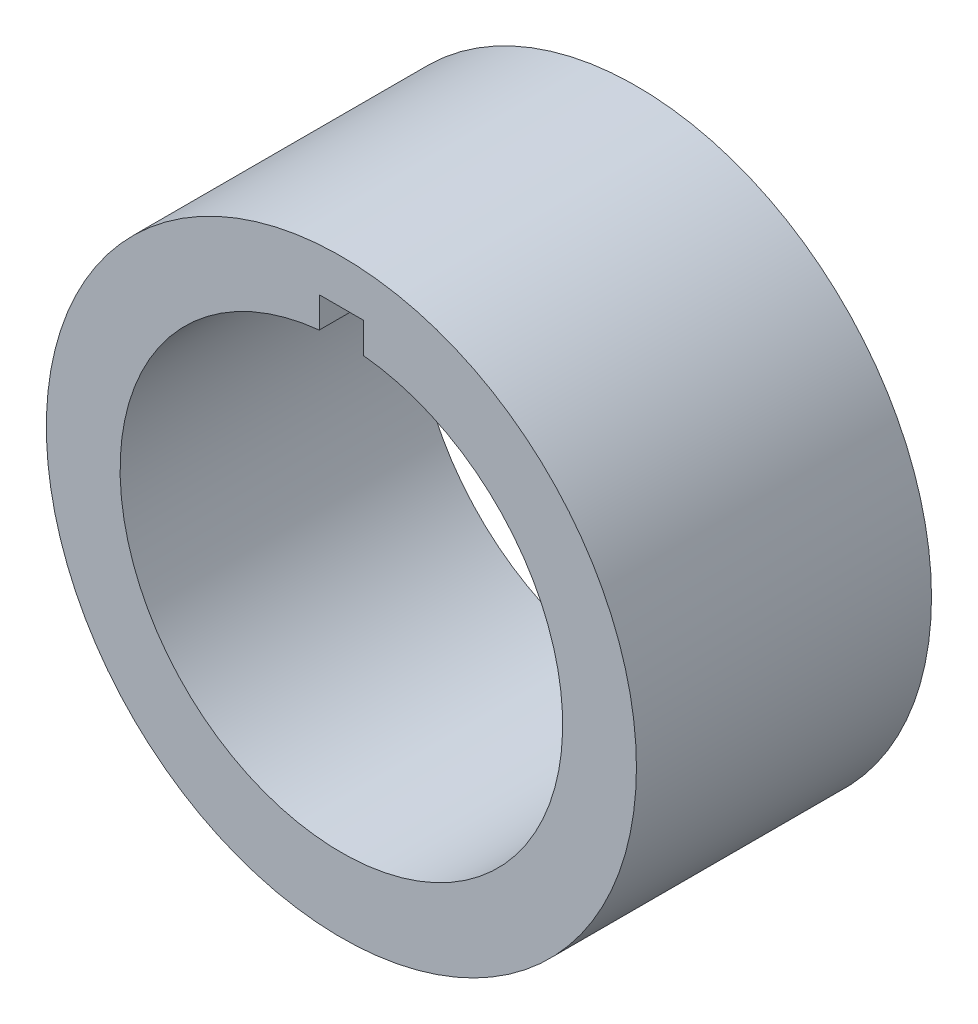
ISO-10303-21;
HEADER;
FILE_DESCRIPTION(('STEP AP214'),'2;1');
FILE_NAME('part.step','',(''),(''),'','','');
FILE_SCHEMA(('AUTOMOTIVE_DESIGN { 1 0 10303 214 1 1 1 1 }'));
ENDSEC;
DATA;
#1=APPLICATION_CONTEXT('core data for automotive mechanical design processes');
#2=APPLICATION_PROTOCOL_DEFINITION('international standard','automotive_design',2000,#1);
#3=PRODUCT_CONTEXT('',#1,'mechanical');
#4=PRODUCT('Part','Part','',(#3));
#5=PRODUCT_RELATED_PRODUCT_CATEGORY('part','',(#4));
#6=PRODUCT_DEFINITION_FORMATION('','',#4);
#7=PRODUCT_DEFINITION_CONTEXT('part definition',#1,'design');
#8=PRODUCT_DEFINITION('design','',#6,#7);
#9=PRODUCT_DEFINITION_SHAPE('','',#8);
#10=(LENGTH_UNIT() NAMED_UNIT(*) SI_UNIT(.MILLI.,.METRE.));
#11=(NAMED_UNIT(*) PLANE_ANGLE_UNIT() SI_UNIT($,.RADIAN.));
#12=(NAMED_UNIT(*) SI_UNIT($,.STERADIAN.) SOLID_ANGLE_UNIT());
#13=UNCERTAINTY_MEASURE_WITH_UNIT(LENGTH_MEASURE(1.E-05),#10,'distance_accuracy_value','');
#14=(GEOMETRIC_REPRESENTATION_CONTEXT(3) GLOBAL_UNCERTAINTY_ASSIGNED_CONTEXT((#13)) GLOBAL_UNIT_ASSIGNED_CONTEXT((#10,
#11,#12)) REPRESENTATION_CONTEXT('',''));
#15=CARTESIAN_POINT('',(0.,0.,0.));
#16=DIRECTION('',(0.,0.,1.));
#17=DIRECTION('',(1.,0.,0.));
#18=AXIS2_PLACEMENT_3D('',#15,#16,#17);
#19=CARTESIAN_POINT('',(0.,0.,20.));
#20=DIRECTION('',(0.,0.,-1.));
#21=DIRECTION('',(-1.,0.,0.));
#22=AXIS2_PLACEMENT_3D('',#19,#20,#21);
#23=CYLINDRICAL_SURFACE('',#22,20.);
#24=CARTESIAN_POINT('',(0.,0.,20.));
#25=DIRECTION('',(0.,0.,1.));
#26=DIRECTION('',(1.,0.,0.));
#27=AXIS2_PLACEMENT_3D('',#24,#25,#26);
#28=CIRCLE('',#27,20.);
#29=CARTESIAN_POINT('',(20.,0.,20.));
#30=VERTEX_POINT('',#29);
#31=EDGE_CURVE('E12',#30,#30,#28,.T.);
#32=ORIENTED_EDGE('',*,*,#31,.F.);
#33=EDGE_LOOP('',(#32));
#34=FACE_BOUND('',#33,.T.);
#35=CARTESIAN_POINT('',(0.,0.,0.));
#36=DIRECTION('',(0.,0.,1.));
#37=DIRECTION('',(1.,0.,0.));
#38=AXIS2_PLACEMENT_3D('',#35,#36,#37);
#39=CIRCLE('',#38,20.);
#40=CARTESIAN_POINT('',(20.,0.,0.));
#41=VERTEX_POINT('',#40);
#42=EDGE_CURVE('E63',#41,#41,#39,.T.);
#43=ORIENTED_EDGE('',*,*,#42,.T.);
#44=EDGE_LOOP('',(#43));
#45=FACE_BOUND('',#44,.T.);
#46=ADVANCED_FACE('F60',(#34,#45),#23,.T.);
#47=CARTESIAN_POINT('',(0.,0.,20.));
#48=DIRECTION('',(0.,0.,1.));
#49=DIRECTION('',(1.,0.,0.));
#50=AXIS2_PLACEMENT_3D('',#47,#48,#49);
#51=PLANE('',#50);
#52=DIRECTION('',(0.,1.,0.));
#53=VECTOR('',#52,1.);
#54=CARTESIAN_POINT('',(1.5,0.,20.));
#55=LINE('',#54,#53);
#56=CARTESIAN_POINT('',(1.5,14.9248115565993,20.));
#57=VERTEX_POINT('',#56);
#58=CARTESIAN_POINT('',(1.5,17.,20.));
#59=VERTEX_POINT('',#58);
#60=EDGE_CURVE('E107',#57,#59,#55,.T.);
#61=ORIENTED_EDGE('',*,*,#60,.F.);
#62=CARTESIAN_POINT('',(0.,0.,20.));
#63=DIRECTION('',(0.,0.,1.));
#64=DIRECTION('',(1.,0.,0.));
#65=AXIS2_PLACEMENT_3D('',#62,#63,#64);
#66=CIRCLE('',#65,15.);
#67=CARTESIAN_POINT('',(-1.50000000000001,14.9248115565993,20.));
#68=VERTEX_POINT('',#67);
#69=EDGE_CURVE('E114',#68,#57,#66,.T.);
#70=ORIENTED_EDGE('',*,*,#69,.F.);
#71=DIRECTION('',(0.,1.,0.));
#72=VECTOR('',#71,1.);
#73=CARTESIAN_POINT('',(-1.5,0.,20.));
#74=LINE('',#73,#72);
#75=CARTESIAN_POINT('',(-1.50000000000001,17.,20.));
#76=VERTEX_POINT('',#75);
#77=EDGE_CURVE('E127',#68,#76,#74,.T.);
#78=ORIENTED_EDGE('',*,*,#77,.T.);
#79=DIRECTION('',(1.,0.,0.));
#80=VECTOR('',#79,1.);
#81=CARTESIAN_POINT('',(-1.50000000000001,17.,20.));
#82=LINE('',#81,#80);
#83=EDGE_CURVE('E75',#76,#59,#82,.T.);
#84=ORIENTED_EDGE('',*,*,#83,.T.);
#85=EDGE_LOOP('',(#61,#70,#78,#84));
#86=FACE_BOUND('',#85,.T.);
#87=ORIENTED_EDGE('',*,*,#31,.T.);
#88=EDGE_LOOP('',(#87));
#89=FACE_BOUND('',#88,.T.);
#90=ADVANCED_FACE('F122',(#86,#89),#51,.T.);
#91=CARTESIAN_POINT('',(0.,0.,0.));
#92=DIRECTION('',(0.,0.,1.));
#93=DIRECTION('',(1.,0.,0.));
#94=AXIS2_PLACEMENT_3D('',#91,#92,#93);
#95=PLANE('',#94);
#96=CARTESIAN_POINT('',(0.,0.,0.));
#97=DIRECTION('',(0.,0.,1.));
#98=DIRECTION('',(1.,0.,0.));
#99=AXIS2_PLACEMENT_3D('',#96,#97,#98);
#100=CIRCLE('',#99,15.);
#101=CARTESIAN_POINT('',(-1.50000000000001,14.9248115565993,0.));
#102=VERTEX_POINT('',#101);
#103=CARTESIAN_POINT('',(1.5,14.9248115565993,0.));
#104=VERTEX_POINT('',#103);
#105=EDGE_CURVE('E83',#102,#104,#100,.T.);
#106=ORIENTED_EDGE('',*,*,#105,.T.);
#107=DIRECTION('',(0.,1.,0.));
#108=VECTOR('',#107,1.);
#109=CARTESIAN_POINT('',(1.5,0.,0.));
#110=LINE('',#109,#108);
#111=CARTESIAN_POINT('',(1.5,17.,0.));
#112=VERTEX_POINT('',#111);
#113=EDGE_CURVE('E109',#104,#112,#110,.T.);
#114=ORIENTED_EDGE('',*,*,#113,.T.);
#115=DIRECTION('',(1.,0.,0.));
#116=VECTOR('',#115,1.);
#117=CARTESIAN_POINT('',(-1.50000000000001,17.,0.));
#118=LINE('',#117,#116);
#119=CARTESIAN_POINT('',(-1.50000000000001,17.,0.));
#120=VERTEX_POINT('',#119);
#121=EDGE_CURVE('E213',#120,#112,#118,.T.);
#122=ORIENTED_EDGE('',*,*,#121,.F.);
#123=DIRECTION('',(0.,1.,0.));
#124=VECTOR('',#123,1.);
#125=CARTESIAN_POINT('',(-1.5,0.,0.));
#126=LINE('',#125,#124);
#127=EDGE_CURVE('E130',#102,#120,#126,.T.);
#128=ORIENTED_EDGE('',*,*,#127,.F.);
#129=EDGE_LOOP('',(#106,#114,#122,#128));
#130=FACE_BOUND('',#129,.T.);
#131=ORIENTED_EDGE('',*,*,#42,.F.);
#132=EDGE_LOOP('',(#131));
#133=FACE_BOUND('',#132,.T.);
#134=ADVANCED_FACE('F148',(#130,#133),#95,.F.);
#135=CARTESIAN_POINT('',(0.,0.,0.));
#136=DIRECTION('',(0.,0.,1.));
#137=DIRECTION('',(1.,0.,0.));
#138=AXIS2_PLACEMENT_3D('',#135,#136,#137);
#139=CYLINDRICAL_SURFACE('',#138,15.);
#140=ORIENTED_EDGE('',*,*,#69,.T.);
#141=DIRECTION('',(0.,0.,1.));
#142=VECTOR('',#141,1.);
#143=CARTESIAN_POINT('',(1.5,14.9248115565993,0.));
#144=LINE('',#143,#142);
#145=EDGE_CURVE('E102',#57,#104,#144,.F.);
#146=ORIENTED_EDGE('',*,*,#145,.T.);
#147=ORIENTED_EDGE('',*,*,#105,.F.);
#148=DIRECTION('',(0.,0.,1.));
#149=VECTOR('',#148,1.);
#150=CARTESIAN_POINT('',(-1.50000000000001,14.9248115565993,0.));
#151=LINE('',#150,#149);
#152=EDGE_CURVE('E111',#68,#102,#151,.F.);
#153=ORIENTED_EDGE('',*,*,#152,.F.);
#154=EDGE_LOOP('',(#140,#146,#147,#153));
#155=FACE_BOUND('',#154,.T.);
#156=ADVANCED_FACE('F115',(#155),#139,.F.);
#157=CARTESIAN_POINT('',(-1.50000000000001,17.,0.));
#158=DIRECTION('',(0.,-1.,0.));
#159=DIRECTION('',(0.,0.,-1.));
#160=AXIS2_PLACEMENT_3D('',#157,#158,#159);
#161=PLANE('',#160);
#162=ORIENTED_EDGE('',*,*,#83,.F.);
#163=DIRECTION('',(0.,0.,1.));
#164=VECTOR('',#163,1.);
#165=CARTESIAN_POINT('',(-1.50000000000001,17.,0.));
#166=LINE('',#165,#164);
#167=EDGE_CURVE('E120',#120,#76,#166,.T.);
#168=ORIENTED_EDGE('',*,*,#167,.F.);
#169=ORIENTED_EDGE('',*,*,#121,.T.);
#170=DIRECTION('',(0.,0.,1.));
#171=VECTOR('',#170,1.);
#172=CARTESIAN_POINT('',(1.5,17.,0.));
#173=LINE('',#172,#171);
#174=EDGE_CURVE('E137',#112,#59,#173,.T.);
#175=ORIENTED_EDGE('',*,*,#174,.T.);
#176=EDGE_LOOP('',(#162,#168,#169,#175));
#177=FACE_BOUND('',#176,.T.);
#178=ADVANCED_FACE('F155',(#177),#161,.T.);
#179=CARTESIAN_POINT('',(1.5,0.,0.));
#180=DIRECTION('',(1.,0.,0.));
#181=DIRECTION('',(0.,0.,-1.));
#182=AXIS2_PLACEMENT_3D('',#179,#180,#181);
#183=PLANE('',#182);
#184=ORIENTED_EDGE('',*,*,#60,.T.);
#185=ORIENTED_EDGE('',*,*,#174,.F.);
#186=ORIENTED_EDGE('',*,*,#113,.F.);
#187=ORIENTED_EDGE('',*,*,#145,.F.);
#188=EDGE_LOOP('',(#184,#185,#186,#187));
#189=FACE_BOUND('',#188,.T.);
#190=ADVANCED_FACE('F104',(#189),#183,.F.);
#191=CARTESIAN_POINT('',(-1.5,0.,0.));
#192=DIRECTION('',(1.,0.,0.));
#193=DIRECTION('',(0.,1.,0.));
#194=AXIS2_PLACEMENT_3D('',#191,#192,#193);
#195=PLANE('',#194);
#196=ORIENTED_EDGE('',*,*,#152,.T.);
#197=ORIENTED_EDGE('',*,*,#127,.T.);
#198=ORIENTED_EDGE('',*,*,#167,.T.);
#199=ORIENTED_EDGE('',*,*,#77,.F.);
#200=EDGE_LOOP('',(#196,#197,#198,#199));
#201=FACE_BOUND('',#200,.T.);
#202=ADVANCED_FACE('F157',(#201),#195,.T.);
#203=CLOSED_SHELL('',(#46,#90,#134,#156,#178,#190,#202));
#204=MANIFOLD_SOLID_BREP('B2',#203);
#205=ADVANCED_BREP_SHAPE_REPRESENTATION('',(#18,#204),#14);
#206=SHAPE_DEFINITION_REPRESENTATION(#9,#205);
ENDSEC;
END-ISO-10303-21;
